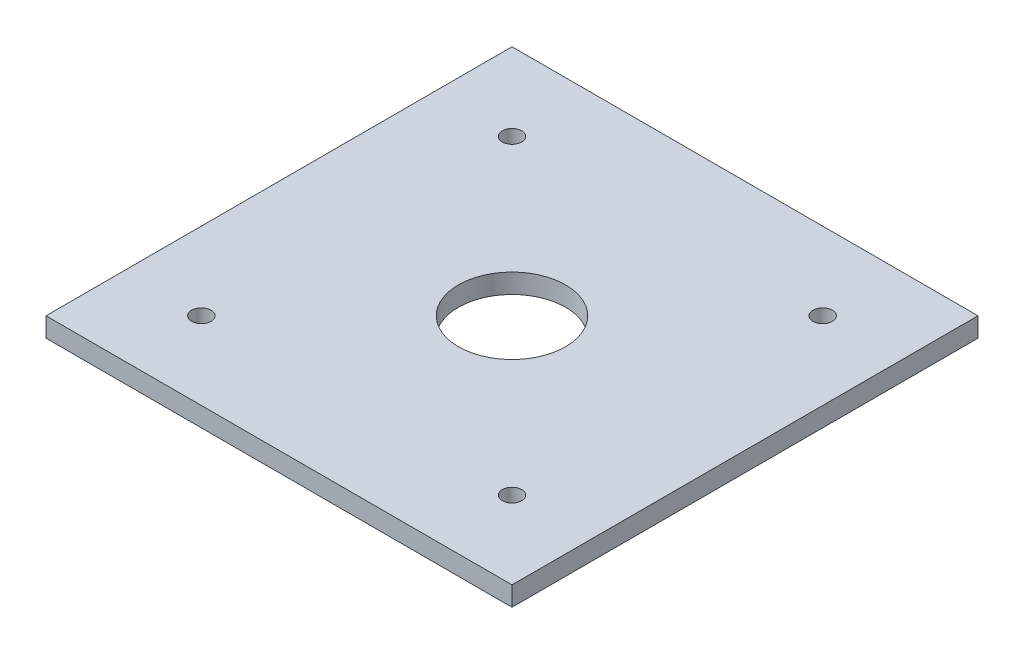
ISO-10303-21;
HEADER;
FILE_DESCRIPTION(('STEP AP214'),'2;1');
FILE_NAME('part.step','',(''),(''),'','','');
FILE_SCHEMA(('AUTOMOTIVE_DESIGN { 1 0 10303 214 1 1 1 1 }'));
ENDSEC;
DATA;
#1=APPLICATION_CONTEXT('core data for automotive mechanical design processes');
#2=APPLICATION_PROTOCOL_DEFINITION('international standard','automotive_design',2000,#1);
#3=PRODUCT_CONTEXT('',#1,'mechanical');
#4=PRODUCT('Part','Part','',(#3));
#5=PRODUCT_RELATED_PRODUCT_CATEGORY('part','',(#4));
#6=PRODUCT_DEFINITION_FORMATION('','',#4);
#7=PRODUCT_DEFINITION_CONTEXT('part definition',#1,'design');
#8=PRODUCT_DEFINITION('design','',#6,#7);
#9=PRODUCT_DEFINITION_SHAPE('','',#8);
#10=(LENGTH_UNIT() NAMED_UNIT(*) SI_UNIT(.MILLI.,.METRE.));
#11=(NAMED_UNIT(*) PLANE_ANGLE_UNIT() SI_UNIT($,.RADIAN.));
#12=(NAMED_UNIT(*) SI_UNIT($,.STERADIAN.) SOLID_ANGLE_UNIT());
#13=UNCERTAINTY_MEASURE_WITH_UNIT(LENGTH_MEASURE(1.E-05),#10,'distance_accuracy_value','');
#14=(GEOMETRIC_REPRESENTATION_CONTEXT(3) GLOBAL_UNCERTAINTY_ASSIGNED_CONTEXT((#13)) GLOBAL_UNIT_ASSIGNED_CONTEXT((#10,
#11,#12)) REPRESENTATION_CONTEXT('',''));
#15=CARTESIAN_POINT('',(0.,0.,0.));
#16=DIRECTION('',(0.,0.,1.));
#17=DIRECTION('',(1.,0.,0.));
#18=AXIS2_PLACEMENT_3D('',#15,#16,#17);
#19=CARTESIAN_POINT('',(0.,6.35,0.));
#20=DIRECTION('',(0.,1.,0.));
#21=DIRECTION('',(0.,0.,1.));
#22=AXIS2_PLACEMENT_3D('',#19,#20,#21);
#23=PLANE('',#22);
#24=CARTESIAN_POINT('',(-50.7999999999995,6.35,50.8000000000005));
#25=DIRECTION('',(0.,1.,0.));
#26=DIRECTION('',(0.,0.,1.));
#27=AXIS2_PLACEMENT_3D('',#24,#25,#26);
#28=CIRCLE('',#27,3.17499999999998);
#29=CARTESIAN_POINT('',(-50.7999999999995,6.35,53.9750000000005));
#30=VERTEX_POINT('',#29);
#31=EDGE_CURVE('E138',#30,#30,#28,.T.);
#32=ORIENTED_EDGE('',*,*,#31,.F.);
#33=EDGE_LOOP('',(#32));
#34=FACE_BOUND('',#33,.T.);
#35=CARTESIAN_POINT('',(-50.8,6.35,-50.8));
#36=DIRECTION('',(0.,1.,0.));
#37=DIRECTION('',(0.,0.,1.));
#38=AXIS2_PLACEMENT_3D('',#35,#36,#37);
#39=CIRCLE('',#38,3.17499999999998);
#40=CARTESIAN_POINT('',(-50.8,6.35,-47.625));
#41=VERTEX_POINT('',#40);
#42=EDGE_CURVE('E132',#41,#41,#39,.T.);
#43=ORIENTED_EDGE('',*,*,#42,.F.);
#44=EDGE_LOOP('',(#43));
#45=FACE_BOUND('',#44,.T.);
#46=CARTESIAN_POINT('',(50.7999999999998,6.35,-50.8000000000002));
#47=DIRECTION('',(0.,1.,0.));
#48=DIRECTION('',(0.,0.,1.));
#49=AXIS2_PLACEMENT_3D('',#46,#47,#48);
#50=CIRCLE('',#49,3.17499999999999);
#51=CARTESIAN_POINT('',(50.7999999999998,6.35,-47.6250000000002));
#52=VERTEX_POINT('',#51);
#53=EDGE_CURVE('E126',#52,#52,#50,.T.);
#54=ORIENTED_EDGE('',*,*,#53,.F.);
#55=EDGE_LOOP('',(#54));
#56=FACE_BOUND('',#55,.T.);
#57=CARTESIAN_POINT('',(50.8,6.35,50.8));
#58=DIRECTION('',(0.,1.,0.));
#59=DIRECTION('',(0.,0.,1.));
#60=AXIS2_PLACEMENT_3D('',#57,#58,#59);
#61=CIRCLE('',#60,3.17499999999998);
#62=CARTESIAN_POINT('',(50.8,6.35,53.975));
#63=VERTEX_POINT('',#62);
#64=EDGE_CURVE('E120',#63,#63,#61,.T.);
#65=ORIENTED_EDGE('',*,*,#64,.F.);
#66=EDGE_LOOP('',(#65));
#67=FACE_BOUND('',#66,.T.);
#68=DIRECTION('',(0.,0.,-1.));
#69=VECTOR('',#68,1.);
#70=CARTESIAN_POINT('',(76.2,6.35,-76.2));
#71=LINE('',#70,#69);
#72=CARTESIAN_POINT('',(76.2,6.35,76.2));
#73=VERTEX_POINT('',#72);
#74=CARTESIAN_POINT('',(76.2,6.35,-76.2));
#75=VERTEX_POINT('',#74);
#76=EDGE_CURVE('E85',#73,#75,#71,.T.);
#77=ORIENTED_EDGE('',*,*,#76,.T.);
#78=DIRECTION('',(-1.,0.,0.));
#79=VECTOR('',#78,1.);
#80=CARTESIAN_POINT('',(-76.2,6.35,-76.2));
#81=LINE('',#80,#79);
#82=CARTESIAN_POINT('',(-76.2,6.35,-76.2));
#83=VERTEX_POINT('',#82);
#84=EDGE_CURVE('E80',#75,#83,#81,.T.);
#85=ORIENTED_EDGE('',*,*,#84,.T.);
#86=DIRECTION('',(0.,0.,1.));
#87=VECTOR('',#86,1.);
#88=CARTESIAN_POINT('',(-76.2,6.35,-76.2));
#89=LINE('',#88,#87);
#90=CARTESIAN_POINT('',(-76.2,6.35,76.2));
#91=VERTEX_POINT('',#90);
#92=EDGE_CURVE('E83',#83,#91,#89,.T.);
#93=ORIENTED_EDGE('',*,*,#92,.T.);
#94=DIRECTION('',(1.,0.,0.));
#95=VECTOR('',#94,1.);
#96=CARTESIAN_POINT('',(-76.2,6.35,76.2));
#97=LINE('',#96,#95);
#98=EDGE_CURVE('E50',#91,#73,#97,.T.);
#99=ORIENTED_EDGE('',*,*,#98,.T.);
#100=EDGE_LOOP('',(#77,#85,#93,#99));
#101=FACE_BOUND('',#100,.T.);
#102=CARTESIAN_POINT('',(0.,6.35,0.));
#103=DIRECTION('',(0.,1.,0.));
#104=DIRECTION('',(0.,0.,1.));
#105=AXIS2_PLACEMENT_3D('',#102,#103,#104);
#106=CIRCLE('',#105,17.526);
#107=CARTESIAN_POINT('',(0.,6.35,17.526));
#108=VERTEX_POINT('',#107);
#109=EDGE_CURVE('E100',#108,#108,#106,.T.);
#110=ORIENTED_EDGE('',*,*,#109,.F.);
#111=EDGE_LOOP('',(#110));
#112=FACE_BOUND('',#111,.T.);
#113=ADVANCED_FACE('F33',(#34,#45,#56,#67,#101,#112),#23,.T.);
#114=CARTESIAN_POINT('',(0.,0.,0.));
#115=DIRECTION('',(0.,1.,0.));
#116=DIRECTION('',(0.,0.,1.));
#117=AXIS2_PLACEMENT_3D('',#114,#115,#116);
#118=PLANE('',#117);
#119=CARTESIAN_POINT('',(-50.7999999999995,0.,50.8000000000005));
#120=DIRECTION('',(0.,1.,0.));
#121=DIRECTION('',(0.,0.,1.));
#122=AXIS2_PLACEMENT_3D('',#119,#120,#121);
#123=CIRCLE('',#122,3.17499999999998);
#124=CARTESIAN_POINT('',(-50.7999999999995,0.,53.9750000000005));
#125=VERTEX_POINT('',#124);
#126=EDGE_CURVE('E135',#125,#125,#123,.T.);
#127=ORIENTED_EDGE('',*,*,#126,.T.);
#128=EDGE_LOOP('',(#127));
#129=FACE_BOUND('',#128,.T.);
#130=CARTESIAN_POINT('',(-50.8,0.,-50.8));
#131=DIRECTION('',(0.,1.,0.));
#132=DIRECTION('',(0.,0.,1.));
#133=AXIS2_PLACEMENT_3D('',#130,#131,#132);
#134=CIRCLE('',#133,3.17499999999998);
#135=CARTESIAN_POINT('',(-50.8,0.,-47.625));
#136=VERTEX_POINT('',#135);
#137=EDGE_CURVE('E129',#136,#136,#134,.T.);
#138=ORIENTED_EDGE('',*,*,#137,.T.);
#139=EDGE_LOOP('',(#138));
#140=FACE_BOUND('',#139,.T.);
#141=CARTESIAN_POINT('',(50.7999999999998,0.,-50.8000000000002));
#142=DIRECTION('',(0.,1.,0.));
#143=DIRECTION('',(0.,0.,1.));
#144=AXIS2_PLACEMENT_3D('',#141,#142,#143);
#145=CIRCLE('',#144,3.17499999999999);
#146=CARTESIAN_POINT('',(50.7999999999998,0.,-47.6250000000002));
#147=VERTEX_POINT('',#146);
#148=EDGE_CURVE('E123',#147,#147,#145,.T.);
#149=ORIENTED_EDGE('',*,*,#148,.T.);
#150=EDGE_LOOP('',(#149));
#151=FACE_BOUND('',#150,.T.);
#152=CARTESIAN_POINT('',(50.8,0.,50.8));
#153=DIRECTION('',(0.,1.,0.));
#154=DIRECTION('',(0.,0.,1.));
#155=AXIS2_PLACEMENT_3D('',#152,#153,#154);
#156=CIRCLE('',#155,3.17499999999998);
#157=CARTESIAN_POINT('',(50.8,0.,53.975));
#158=VERTEX_POINT('',#157);
#159=EDGE_CURVE('E115',#158,#158,#156,.T.);
#160=ORIENTED_EDGE('',*,*,#159,.T.);
#161=EDGE_LOOP('',(#160));
#162=FACE_BOUND('',#161,.T.);
#163=DIRECTION('',(0.,0.,-1.));
#164=VECTOR('',#163,1.);
#165=CARTESIAN_POINT('',(76.2,0.,-76.2));
#166=LINE('',#165,#164);
#167=CARTESIAN_POINT('',(76.2,0.,76.2));
#168=VERTEX_POINT('',#167);
#169=CARTESIAN_POINT('',(76.2,0.,-76.2));
#170=VERTEX_POINT('',#169);
#171=EDGE_CURVE('E97',#168,#170,#166,.T.);
#172=ORIENTED_EDGE('',*,*,#171,.F.);
#173=DIRECTION('',(1.,0.,0.));
#174=VECTOR('',#173,1.);
#175=CARTESIAN_POINT('',(-76.2,0.,76.2));
#176=LINE('',#175,#174);
#177=CARTESIAN_POINT('',(-76.2,0.,76.2));
#178=VERTEX_POINT('',#177);
#179=EDGE_CURVE('E73',#178,#168,#176,.T.);
#180=ORIENTED_EDGE('',*,*,#179,.F.);
#181=DIRECTION('',(0.,0.,1.));
#182=VECTOR('',#181,1.);
#183=CARTESIAN_POINT('',(-76.2,0.,-76.2));
#184=LINE('',#183,#182);
#185=CARTESIAN_POINT('',(-76.2,0.,-76.2));
#186=VERTEX_POINT('',#185);
#187=EDGE_CURVE('E67',#186,#178,#184,.T.);
#188=ORIENTED_EDGE('',*,*,#187,.F.);
#189=DIRECTION('',(-1.,0.,0.));
#190=VECTOR('',#189,1.);
#191=CARTESIAN_POINT('',(-76.2,0.,-76.2));
#192=LINE('',#191,#190);
#193=EDGE_CURVE('E89',#170,#186,#192,.T.);
#194=ORIENTED_EDGE('',*,*,#193,.F.);
#195=EDGE_LOOP('',(#172,#180,#188,#194));
#196=FACE_BOUND('',#195,.T.);
#197=CARTESIAN_POINT('',(0.,0.,0.));
#198=DIRECTION('',(0.,1.,0.));
#199=DIRECTION('',(0.,0.,1.));
#200=AXIS2_PLACEMENT_3D('',#197,#198,#199);
#201=CIRCLE('',#200,17.526);
#202=CARTESIAN_POINT('',(0.,0.,17.526));
#203=VERTEX_POINT('',#202);
#204=EDGE_CURVE('E112',#203,#203,#201,.T.);
#205=ORIENTED_EDGE('',*,*,#204,.T.);
#206=EDGE_LOOP('',(#205));
#207=FACE_BOUND('',#206,.T.);
#208=ADVANCED_FACE('F108',(#129,#140,#151,#162,#196,#207),#118,.F.);
#209=CARTESIAN_POINT('',(76.2,6.35,-76.2));
#210=DIRECTION('',(-1.,0.,0.));
#211=DIRECTION('',(0.,0.,1.));
#212=AXIS2_PLACEMENT_3D('',#209,#210,#211);
#213=PLANE('',#212);
#214=ORIENTED_EDGE('',*,*,#171,.T.);
#215=DIRECTION('',(0.,-1.,0.));
#216=VECTOR('',#215,1.);
#217=CARTESIAN_POINT('',(76.2,6.35,-76.2));
#218=LINE('',#217,#216);
#219=EDGE_CURVE('E11',#75,#170,#218,.T.);
#220=ORIENTED_EDGE('',*,*,#219,.F.);
#221=ORIENTED_EDGE('',*,*,#76,.F.);
#222=DIRECTION('',(0.,-1.,0.));
#223=VECTOR('',#222,1.);
#224=CARTESIAN_POINT('',(76.2,6.35,76.2));
#225=LINE('',#224,#223);
#226=EDGE_CURVE('E93',#73,#168,#225,.T.);
#227=ORIENTED_EDGE('',*,*,#226,.T.);
#228=EDGE_LOOP('',(#214,#220,#221,#227));
#229=FACE_BOUND('',#228,.T.);
#230=ADVANCED_FACE('F35',(#229),#213,.F.);
#231=CARTESIAN_POINT('',(-76.2,6.35,-76.2));
#232=DIRECTION('',(0.,0.,1.));
#233=DIRECTION('',(1.,0.,0.));
#234=AXIS2_PLACEMENT_3D('',#231,#232,#233);
#235=PLANE('',#234);
#236=ORIENTED_EDGE('',*,*,#193,.T.);
#237=DIRECTION('',(0.,-1.,0.));
#238=VECTOR('',#237,1.);
#239=CARTESIAN_POINT('',(-76.2,6.35,-76.2));
#240=LINE('',#239,#238);
#241=EDGE_CURVE('E42',#83,#186,#240,.T.);
#242=ORIENTED_EDGE('',*,*,#241,.F.);
#243=ORIENTED_EDGE('',*,*,#84,.F.);
#244=ORIENTED_EDGE('',*,*,#219,.T.);
#245=EDGE_LOOP('',(#236,#242,#243,#244));
#246=FACE_BOUND('',#245,.T.);
#247=ADVANCED_FACE('F88',(#246),#235,.F.);
#248=CARTESIAN_POINT('',(-76.2,6.35,-76.2));
#249=DIRECTION('',(1.,0.,0.));
#250=DIRECTION('',(0.,0.,-1.));
#251=AXIS2_PLACEMENT_3D('',#248,#249,#250);
#252=PLANE('',#251);
#253=ORIENTED_EDGE('',*,*,#187,.T.);
#254=DIRECTION('',(0.,-1.,0.));
#255=VECTOR('',#254,1.);
#256=CARTESIAN_POINT('',(-76.2,6.35,76.2));
#257=LINE('',#256,#255);
#258=EDGE_CURVE('E90',#91,#178,#257,.T.);
#259=ORIENTED_EDGE('',*,*,#258,.F.);
#260=ORIENTED_EDGE('',*,*,#92,.F.);
#261=ORIENTED_EDGE('',*,*,#241,.T.);
#262=EDGE_LOOP('',(#253,#259,#260,#261));
#263=FACE_BOUND('',#262,.T.);
#264=ADVANCED_FACE('F91',(#263),#252,.F.);
#265=CARTESIAN_POINT('',(-76.2,6.35,76.2));
#266=DIRECTION('',(0.,0.,-1.));
#267=DIRECTION('',(-1.,0.,0.));
#268=AXIS2_PLACEMENT_3D('',#265,#266,#267);
#269=PLANE('',#268);
#270=ORIENTED_EDGE('',*,*,#179,.T.);
#271=ORIENTED_EDGE('',*,*,#226,.F.);
#272=ORIENTED_EDGE('',*,*,#98,.F.);
#273=ORIENTED_EDGE('',*,*,#258,.T.);
#274=EDGE_LOOP('',(#270,#271,#272,#273));
#275=FACE_BOUND('',#274,.T.);
#276=ADVANCED_FACE('F105',(#275),#269,.F.);
#277=CARTESIAN_POINT('',(0.,6.35,0.));
#278=DIRECTION('',(0.,-1.,0.));
#279=DIRECTION('',(0.,0.,-1.));
#280=AXIS2_PLACEMENT_3D('',#277,#278,#279);
#281=CYLINDRICAL_SURFACE('',#280,17.526);
#282=ORIENTED_EDGE('',*,*,#109,.T.);
#283=EDGE_LOOP('',(#282));
#284=FACE_BOUND('',#283,.T.);
#285=ORIENTED_EDGE('',*,*,#204,.F.);
#286=EDGE_LOOP('',(#285));
#287=FACE_BOUND('',#286,.T.);
#288=ADVANCED_FACE('F156',(#284,#287),#281,.F.);
#289=CARTESIAN_POINT('',(50.8,6.35,50.8));
#290=DIRECTION('',(0.,1.,0.));
#291=DIRECTION('',(0.,0.,1.));
#292=AXIS2_PLACEMENT_3D('',#289,#290,#291);
#293=CYLINDRICAL_SURFACE('',#292,3.17499999999998);
#294=ORIENTED_EDGE('',*,*,#159,.F.);
#295=EDGE_LOOP('',(#294));
#296=FACE_BOUND('',#295,.T.);
#297=ORIENTED_EDGE('',*,*,#64,.T.);
#298=EDGE_LOOP('',(#297));
#299=FACE_BOUND('',#298,.T.);
#300=ADVANCED_FACE('F153',(#296,#299),#293,.F.);
#301=CARTESIAN_POINT('',(50.7999999999998,6.35,-50.8000000000002));
#302=DIRECTION('',(0.,1.,0.));
#303=DIRECTION('',(0.,0.,1.));
#304=AXIS2_PLACEMENT_3D('',#301,#302,#303);
#305=CYLINDRICAL_SURFACE('',#304,3.17499999999999);
#306=ORIENTED_EDGE('',*,*,#148,.F.);
#307=EDGE_LOOP('',(#306));
#308=FACE_BOUND('',#307,.T.);
#309=ORIENTED_EDGE('',*,*,#53,.T.);
#310=EDGE_LOOP('',(#309));
#311=FACE_BOUND('',#310,.T.);
#312=ADVANCED_FACE('F155',(#308,#311),#305,.F.);
#313=CARTESIAN_POINT('',(-50.8,6.35,-50.8));
#314=DIRECTION('',(0.,1.,0.));
#315=DIRECTION('',(0.,0.,1.));
#316=AXIS2_PLACEMENT_3D('',#313,#314,#315);
#317=CYLINDRICAL_SURFACE('',#316,3.17499999999998);
#318=ORIENTED_EDGE('',*,*,#137,.F.);
#319=EDGE_LOOP('',(#318));
#320=FACE_BOUND('',#319,.T.);
#321=ORIENTED_EDGE('',*,*,#42,.T.);
#322=EDGE_LOOP('',(#321));
#323=FACE_BOUND('',#322,.T.);
#324=ADVANCED_FACE('F163',(#320,#323),#317,.F.);
#325=CARTESIAN_POINT('',(-50.7999999999995,6.35,50.8000000000005));
#326=DIRECTION('',(0.,1.,0.));
#327=DIRECTION('',(0.,0.,1.));
#328=AXIS2_PLACEMENT_3D('',#325,#326,#327);
#329=CYLINDRICAL_SURFACE('',#328,3.17499999999998);
#330=ORIENTED_EDGE('',*,*,#126,.F.);
#331=EDGE_LOOP('',(#330));
#332=FACE_BOUND('',#331,.T.);
#333=ORIENTED_EDGE('',*,*,#31,.T.);
#334=EDGE_LOOP('',(#333));
#335=FACE_BOUND('',#334,.T.);
#336=ADVANCED_FACE('F142',(#332,#335),#329,.F.);
#337=CLOSED_SHELL('',(#113,#208,#230,#247,#264,#276,#288,#300,#312,#324,#336));
#338=MANIFOLD_SOLID_BREP('B2',#337);
#339=ADVANCED_BREP_SHAPE_REPRESENTATION('',(#18,#338),#14);
#340=SHAPE_DEFINITION_REPRESENTATION(#9,#339);
ENDSEC;
END-ISO-10303-21;
